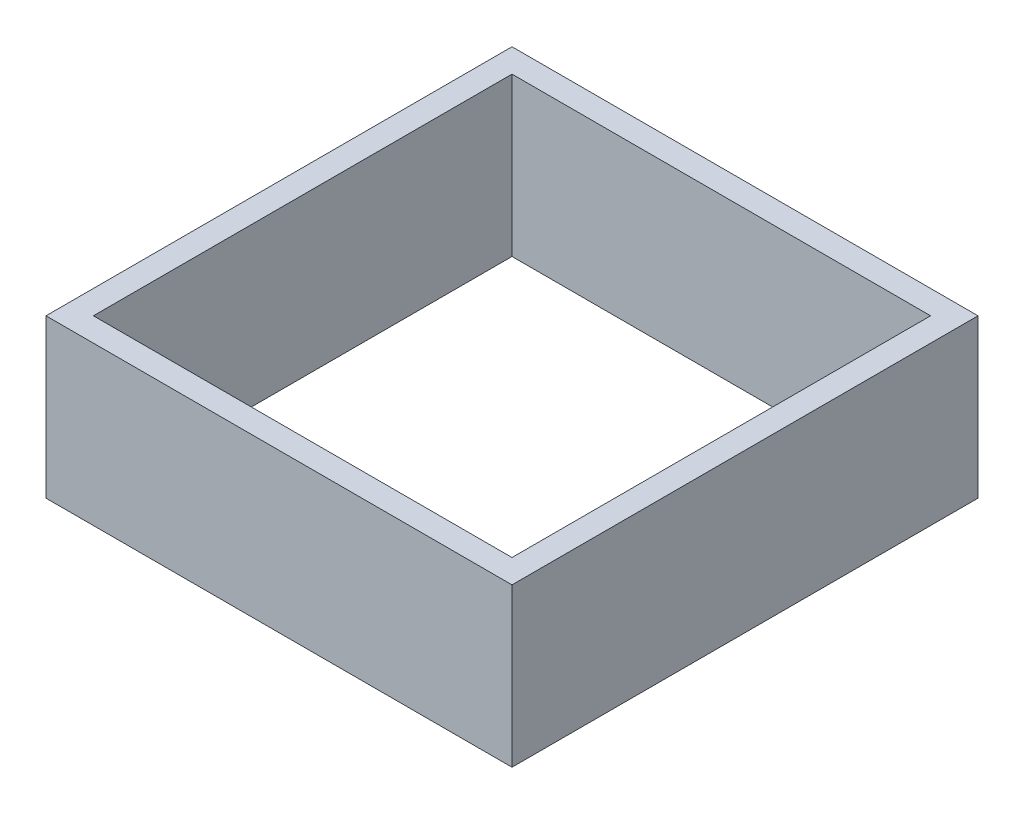
ISO-10303-21;
HEADER;
FILE_DESCRIPTION(('STEP AP214'),'2;1');
FILE_NAME('part.step','',(''),(''),'','','');
FILE_SCHEMA(('AUTOMOTIVE_DESIGN { 1 0 10303 214 1 1 1 1 }'));
ENDSEC;
DATA;
#1=APPLICATION_CONTEXT('core data for automotive mechanical design processes');
#2=APPLICATION_PROTOCOL_DEFINITION('international standard','automotive_design',2000,#1);
#3=PRODUCT_CONTEXT('',#1,'mechanical');
#4=PRODUCT('Part','Part','',(#3));
#5=PRODUCT_RELATED_PRODUCT_CATEGORY('part','',(#4));
#6=PRODUCT_DEFINITION_FORMATION('','',#4);
#7=PRODUCT_DEFINITION_CONTEXT('part definition',#1,'design');
#8=PRODUCT_DEFINITION('design','',#6,#7);
#9=PRODUCT_DEFINITION_SHAPE('','',#8);
#10=(LENGTH_UNIT() NAMED_UNIT(*) SI_UNIT(.MILLI.,.METRE.));
#11=(NAMED_UNIT(*) PLANE_ANGLE_UNIT() SI_UNIT($,.RADIAN.));
#12=(NAMED_UNIT(*) SI_UNIT($,.STERADIAN.) SOLID_ANGLE_UNIT());
#13=UNCERTAINTY_MEASURE_WITH_UNIT(LENGTH_MEASURE(1.E-05),#10,'distance_accuracy_value','');
#14=(GEOMETRIC_REPRESENTATION_CONTEXT(3) GLOBAL_UNCERTAINTY_ASSIGNED_CONTEXT((#13)) GLOBAL_UNIT_ASSIGNED_CONTEXT((#10,
#11,#12)) REPRESENTATION_CONTEXT('',''));
#15=CARTESIAN_POINT('',(0.,0.,0.));
#16=DIRECTION('',(0.,0.,1.));
#17=DIRECTION('',(1.,0.,0.));
#18=AXIS2_PLACEMENT_3D('',#15,#16,#17);
#19=CARTESIAN_POINT('',(0.,20.,0.));
#20=DIRECTION('',(0.,-1.,0.));
#21=DIRECTION('',(0.,0.,-1.));
#22=AXIS2_PLACEMENT_3D('',#19,#20,#21);
#23=PLANE('',#22);
#24=DIRECTION('',(0.,0.,-1.));
#25=VECTOR('',#24,1.);
#26=CARTESIAN_POINT('',(29.5,20.,29.5));
#27=LINE('',#26,#25);
#28=CARTESIAN_POINT('',(29.5,20.,29.5));
#29=VERTEX_POINT('',#28);
#30=CARTESIAN_POINT('',(29.5,20.,-29.5));
#31=VERTEX_POINT('',#30);
#32=EDGE_CURVE('E153',#29,#31,#27,.T.);
#33=ORIENTED_EDGE('',*,*,#32,.T.);
#34=DIRECTION('',(-1.,0.,0.));
#35=VECTOR('',#34,1.);
#36=CARTESIAN_POINT('',(-29.5,20.,-29.5));
#37=LINE('',#36,#35);
#38=CARTESIAN_POINT('',(-29.5,20.,-29.5));
#39=VERTEX_POINT('',#38);
#40=EDGE_CURVE('E157',#31,#39,#37,.T.);
#41=ORIENTED_EDGE('',*,*,#40,.T.);
#42=DIRECTION('',(0.,0.,1.));
#43=VECTOR('',#42,1.);
#44=CARTESIAN_POINT('',(-29.5,20.,29.5));
#45=LINE('',#44,#43);
#46=CARTESIAN_POINT('',(-29.5,20.,29.5));
#47=VERTEX_POINT('',#46);
#48=EDGE_CURVE('E161',#39,#47,#45,.T.);
#49=ORIENTED_EDGE('',*,*,#48,.T.);
#50=DIRECTION('',(1.,0.,0.));
#51=VECTOR('',#50,1.);
#52=CARTESIAN_POINT('',(-29.5,20.,29.5));
#53=LINE('',#52,#51);
#54=EDGE_CURVE('E164',#47,#29,#53,.T.);
#55=ORIENTED_EDGE('',*,*,#54,.T.);
#56=EDGE_LOOP('',(#33,#41,#49,#55));
#57=FACE_BOUND('',#56,.T.);
#58=DIRECTION('',(0.,0.,-1.));
#59=VECTOR('',#58,1.);
#60=CARTESIAN_POINT('',(26.5,20.,26.5));
#61=LINE('',#60,#59);
#62=CARTESIAN_POINT('',(26.5,20.,26.5));
#63=VERTEX_POINT('',#62);
#64=CARTESIAN_POINT('',(26.5,20.,-26.5));
#65=VERTEX_POINT('',#64);
#66=EDGE_CURVE('E105',#63,#65,#61,.T.);
#67=ORIENTED_EDGE('',*,*,#66,.F.);
#68=DIRECTION('',(1.,0.,0.));
#69=VECTOR('',#68,1.);
#70=CARTESIAN_POINT('',(-26.5,20.,26.5));
#71=LINE('',#70,#69);
#72=CARTESIAN_POINT('',(-26.5,20.,26.5));
#73=VERTEX_POINT('',#72);
#74=EDGE_CURVE('E131',#73,#63,#71,.T.);
#75=ORIENTED_EDGE('',*,*,#74,.F.);
#76=DIRECTION('',(0.,0.,1.));
#77=VECTOR('',#76,1.);
#78=CARTESIAN_POINT('',(-26.5,20.,26.5));
#79=LINE('',#78,#77);
#80=CARTESIAN_POINT('',(-26.5,20.,-26.5));
#81=VERTEX_POINT('',#80);
#82=EDGE_CURVE('E127',#81,#73,#79,.T.);
#83=ORIENTED_EDGE('',*,*,#82,.F.);
#84=DIRECTION('',(-1.,0.,0.));
#85=VECTOR('',#84,1.);
#86=CARTESIAN_POINT('',(-26.5,20.,-26.5));
#87=LINE('',#86,#85);
#88=EDGE_CURVE('E114',#65,#81,#87,.T.);
#89=ORIENTED_EDGE('',*,*,#88,.F.);
#90=EDGE_LOOP('',(#67,#75,#83,#89));
#91=FACE_BOUND('',#90,.T.);
#92=ADVANCED_FACE('F39',(#57,#91),#23,.F.);
#93=CARTESIAN_POINT('',(0.,0.,0.));
#94=DIRECTION('',(0.,-1.,0.));
#95=DIRECTION('',(0.,0.,-1.));
#96=AXIS2_PLACEMENT_3D('',#93,#94,#95);
#97=PLANE('',#96);
#98=DIRECTION('',(0.,0.,-1.));
#99=VECTOR('',#98,1.);
#100=CARTESIAN_POINT('',(29.5,0.,29.5));
#101=LINE('',#100,#99);
#102=CARTESIAN_POINT('',(29.5,0.,29.5));
#103=VERTEX_POINT('',#102);
#104=CARTESIAN_POINT('',(29.5,0.,-29.5));
#105=VERTEX_POINT('',#104);
#106=EDGE_CURVE('E123',#103,#105,#101,.T.);
#107=ORIENTED_EDGE('',*,*,#106,.F.);
#108=DIRECTION('',(1.,0.,0.));
#109=VECTOR('',#108,1.);
#110=CARTESIAN_POINT('',(-29.5,0.,29.5));
#111=LINE('',#110,#109);
#112=CARTESIAN_POINT('',(-29.5,0.,29.5));
#113=VERTEX_POINT('',#112);
#114=EDGE_CURVE('E158',#113,#103,#111,.T.);
#115=ORIENTED_EDGE('',*,*,#114,.F.);
#116=DIRECTION('',(0.,0.,1.));
#117=VECTOR('',#116,1.);
#118=CARTESIAN_POINT('',(-29.5,0.,29.5));
#119=LINE('',#118,#117);
#120=CARTESIAN_POINT('',(-29.5,0.,-29.5));
#121=VERTEX_POINT('',#120);
#122=EDGE_CURVE('E174',#121,#113,#119,.T.);
#123=ORIENTED_EDGE('',*,*,#122,.F.);
#124=DIRECTION('',(-1.,0.,0.));
#125=VECTOR('',#124,1.);
#126=CARTESIAN_POINT('',(-29.5,0.,-29.5));
#127=LINE('',#126,#125);
#128=EDGE_CURVE('E171',#105,#121,#127,.T.);
#129=ORIENTED_EDGE('',*,*,#128,.F.);
#130=EDGE_LOOP('',(#107,#115,#123,#129));
#131=FACE_BOUND('',#130,.T.);
#132=DIRECTION('',(1.,0.,0.));
#133=VECTOR('',#132,1.);
#134=CARTESIAN_POINT('',(-26.5,0.,26.5));
#135=LINE('',#134,#133);
#136=CARTESIAN_POINT('',(-26.5,0.,26.5));
#137=VERTEX_POINT('',#136);
#138=CARTESIAN_POINT('',(26.5,0.,26.5));
#139=VERTEX_POINT('',#138);
#140=EDGE_CURVE('E115',#137,#139,#135,.T.);
#141=ORIENTED_EDGE('',*,*,#140,.T.);
#142=DIRECTION('',(0.,0.,-1.));
#143=VECTOR('',#142,1.);
#144=CARTESIAN_POINT('',(26.5,0.,26.5));
#145=LINE('',#144,#143);
#146=CARTESIAN_POINT('',(26.5,0.,-26.5));
#147=VERTEX_POINT('',#146);
#148=EDGE_CURVE('E63',#139,#147,#145,.T.);
#149=ORIENTED_EDGE('',*,*,#148,.T.);
#150=DIRECTION('',(-1.,0.,0.));
#151=VECTOR('',#150,1.);
#152=CARTESIAN_POINT('',(-26.5,0.,-26.5));
#153=LINE('',#152,#151);
#154=CARTESIAN_POINT('',(-26.5,0.,-26.5));
#155=VERTEX_POINT('',#154);
#156=EDGE_CURVE('E121',#147,#155,#153,.T.);
#157=ORIENTED_EDGE('',*,*,#156,.T.);
#158=DIRECTION('',(0.,0.,1.));
#159=VECTOR('',#158,1.);
#160=CARTESIAN_POINT('',(-26.5,0.,26.5));
#161=LINE('',#160,#159);
#162=EDGE_CURVE('E140',#155,#137,#161,.T.);
#163=ORIENTED_EDGE('',*,*,#162,.T.);
#164=EDGE_LOOP('',(#141,#149,#157,#163));
#165=FACE_BOUND('',#164,.T.);
#166=ADVANCED_FACE('F197',(#131,#165),#97,.T.);
#167=CARTESIAN_POINT('',(29.5,20.,29.5));
#168=DIRECTION('',(-1.,0.,0.));
#169=DIRECTION('',(0.,0.,1.));
#170=AXIS2_PLACEMENT_3D('',#167,#168,#169);
#171=PLANE('',#170);
#172=ORIENTED_EDGE('',*,*,#106,.T.);
#173=DIRECTION('',(0.,-1.,0.));
#174=VECTOR('',#173,1.);
#175=CARTESIAN_POINT('',(29.5,20.,-29.5));
#176=LINE('',#175,#174);
#177=EDGE_CURVE('E11',#31,#105,#176,.T.);
#178=ORIENTED_EDGE('',*,*,#177,.F.);
#179=ORIENTED_EDGE('',*,*,#32,.F.);
#180=DIRECTION('',(0.,-1.,0.));
#181=VECTOR('',#180,1.);
#182=CARTESIAN_POINT('',(29.5,20.,29.5));
#183=LINE('',#182,#181);
#184=EDGE_CURVE('E167',#29,#103,#183,.T.);
#185=ORIENTED_EDGE('',*,*,#184,.T.);
#186=EDGE_LOOP('',(#172,#178,#179,#185));
#187=FACE_BOUND('',#186,.T.);
#188=ADVANCED_FACE('F41',(#187),#171,.F.);
#189=CARTESIAN_POINT('',(-29.5,20.,-29.5));
#190=DIRECTION('',(0.,0.,1.));
#191=DIRECTION('',(1.,0.,0.));
#192=AXIS2_PLACEMENT_3D('',#189,#190,#191);
#193=PLANE('',#192);
#194=ORIENTED_EDGE('',*,*,#128,.T.);
#195=DIRECTION('',(0.,-1.,0.));
#196=VECTOR('',#195,1.);
#197=CARTESIAN_POINT('',(-29.5,20.,-29.5));
#198=LINE('',#197,#196);
#199=EDGE_CURVE('E48',#39,#121,#198,.T.);
#200=ORIENTED_EDGE('',*,*,#199,.F.);
#201=ORIENTED_EDGE('',*,*,#40,.F.);
#202=ORIENTED_EDGE('',*,*,#177,.T.);
#203=EDGE_LOOP('',(#194,#200,#201,#202));
#204=FACE_BOUND('',#203,.T.);
#205=ADVANCED_FACE('F207',(#204),#193,.F.);
#206=CARTESIAN_POINT('',(-29.5,20.,29.5));
#207=DIRECTION('',(1.,0.,0.));
#208=DIRECTION('',(0.,0.,-1.));
#209=AXIS2_PLACEMENT_3D('',#206,#207,#208);
#210=PLANE('',#209);
#211=ORIENTED_EDGE('',*,*,#122,.T.);
#212=DIRECTION('',(0.,-1.,0.));
#213=VECTOR('',#212,1.);
#214=CARTESIAN_POINT('',(-29.5,20.,29.5));
#215=LINE('',#214,#213);
#216=EDGE_CURVE('E182',#47,#113,#215,.T.);
#217=ORIENTED_EDGE('',*,*,#216,.F.);
#218=ORIENTED_EDGE('',*,*,#48,.F.);
#219=ORIENTED_EDGE('',*,*,#199,.T.);
#220=EDGE_LOOP('',(#211,#217,#218,#219));
#221=FACE_BOUND('',#220,.T.);
#222=ADVANCED_FACE('F191',(#221),#210,.F.);
#223=CARTESIAN_POINT('',(-29.5,20.,29.5));
#224=DIRECTION('',(0.,0.,-1.));
#225=DIRECTION('',(-1.,0.,0.));
#226=AXIS2_PLACEMENT_3D('',#223,#224,#225);
#227=PLANE('',#226);
#228=ORIENTED_EDGE('',*,*,#114,.T.);
#229=ORIENTED_EDGE('',*,*,#184,.F.);
#230=ORIENTED_EDGE('',*,*,#54,.F.);
#231=ORIENTED_EDGE('',*,*,#216,.T.);
#232=EDGE_LOOP('',(#228,#229,#230,#231));
#233=FACE_BOUND('',#232,.T.);
#234=ADVANCED_FACE('F201',(#233),#227,.F.);
#235=CARTESIAN_POINT('',(26.5,20.,26.5));
#236=DIRECTION('',(-1.,0.,0.));
#237=DIRECTION('',(0.,0.,1.));
#238=AXIS2_PLACEMENT_3D('',#235,#236,#237);
#239=PLANE('',#238);
#240=ORIENTED_EDGE('',*,*,#148,.F.);
#241=DIRECTION('',(0.,-1.,0.));
#242=VECTOR('',#241,1.);
#243=CARTESIAN_POINT('',(26.5,20.,26.5));
#244=LINE('',#243,#242);
#245=EDGE_CURVE('E109',#63,#139,#244,.T.);
#246=ORIENTED_EDGE('',*,*,#245,.F.);
#247=ORIENTED_EDGE('',*,*,#66,.T.);
#248=DIRECTION('',(0.,-1.,0.));
#249=VECTOR('',#248,1.);
#250=CARTESIAN_POINT('',(26.5,20.,-26.5));
#251=LINE('',#250,#249);
#252=EDGE_CURVE('E108',#65,#147,#251,.T.);
#253=ORIENTED_EDGE('',*,*,#252,.T.);
#254=EDGE_LOOP('',(#240,#246,#247,#253));
#255=FACE_BOUND('',#254,.T.);
#256=ADVANCED_FACE('F107',(#255),#239,.T.);
#257=CARTESIAN_POINT('',(-26.5,20.,-26.5));
#258=DIRECTION('',(0.,0.,1.));
#259=DIRECTION('',(1.,0.,0.));
#260=AXIS2_PLACEMENT_3D('',#257,#258,#259);
#261=PLANE('',#260);
#262=ORIENTED_EDGE('',*,*,#156,.F.);
#263=ORIENTED_EDGE('',*,*,#252,.F.);
#264=ORIENTED_EDGE('',*,*,#88,.T.);
#265=DIRECTION('',(0.,-1.,0.));
#266=VECTOR('',#265,1.);
#267=CARTESIAN_POINT('',(-26.5,20.,-26.5));
#268=LINE('',#267,#266);
#269=EDGE_CURVE('E124',#81,#155,#268,.T.);
#270=ORIENTED_EDGE('',*,*,#269,.T.);
#271=EDGE_LOOP('',(#262,#263,#264,#270));
#272=FACE_BOUND('',#271,.T.);
#273=ADVANCED_FACE('F118',(#272),#261,.T.);
#274=CARTESIAN_POINT('',(-26.5,20.,26.5));
#275=DIRECTION('',(1.,0.,0.));
#276=DIRECTION('',(0.,0.,-1.));
#277=AXIS2_PLACEMENT_3D('',#274,#275,#276);
#278=PLANE('',#277);
#279=ORIENTED_EDGE('',*,*,#162,.F.);
#280=ORIENTED_EDGE('',*,*,#269,.F.);
#281=ORIENTED_EDGE('',*,*,#82,.T.);
#282=DIRECTION('',(0.,-1.,0.));
#283=VECTOR('',#282,1.);
#284=CARTESIAN_POINT('',(-26.5,20.,26.5));
#285=LINE('',#284,#283);
#286=EDGE_CURVE('E55',#73,#137,#285,.T.);
#287=ORIENTED_EDGE('',*,*,#286,.T.);
#288=EDGE_LOOP('',(#279,#280,#281,#287));
#289=FACE_BOUND('',#288,.T.);
#290=ADVANCED_FACE('F230',(#289),#278,.T.);
#291=CARTESIAN_POINT('',(-26.5,20.,26.5));
#292=DIRECTION('',(0.,0.,-1.));
#293=DIRECTION('',(-1.,0.,0.));
#294=AXIS2_PLACEMENT_3D('',#291,#292,#293);
#295=PLANE('',#294);
#296=ORIENTED_EDGE('',*,*,#140,.F.);
#297=ORIENTED_EDGE('',*,*,#286,.F.);
#298=ORIENTED_EDGE('',*,*,#74,.T.);
#299=ORIENTED_EDGE('',*,*,#245,.T.);
#300=EDGE_LOOP('',(#296,#297,#298,#299));
#301=FACE_BOUND('',#300,.T.);
#302=ADVANCED_FACE('F234',(#301),#295,.T.);
#303=CLOSED_SHELL('',(#92,#166,#188,#205,#222,#234,#256,#273,#290,#302));
#304=MANIFOLD_SOLID_BREP('B2',#303);
#305=ADVANCED_BREP_SHAPE_REPRESENTATION('',(#18,#304),#14);
#306=SHAPE_DEFINITION_REPRESENTATION(#9,#305);
ENDSEC;
END-ISO-10303-21;
